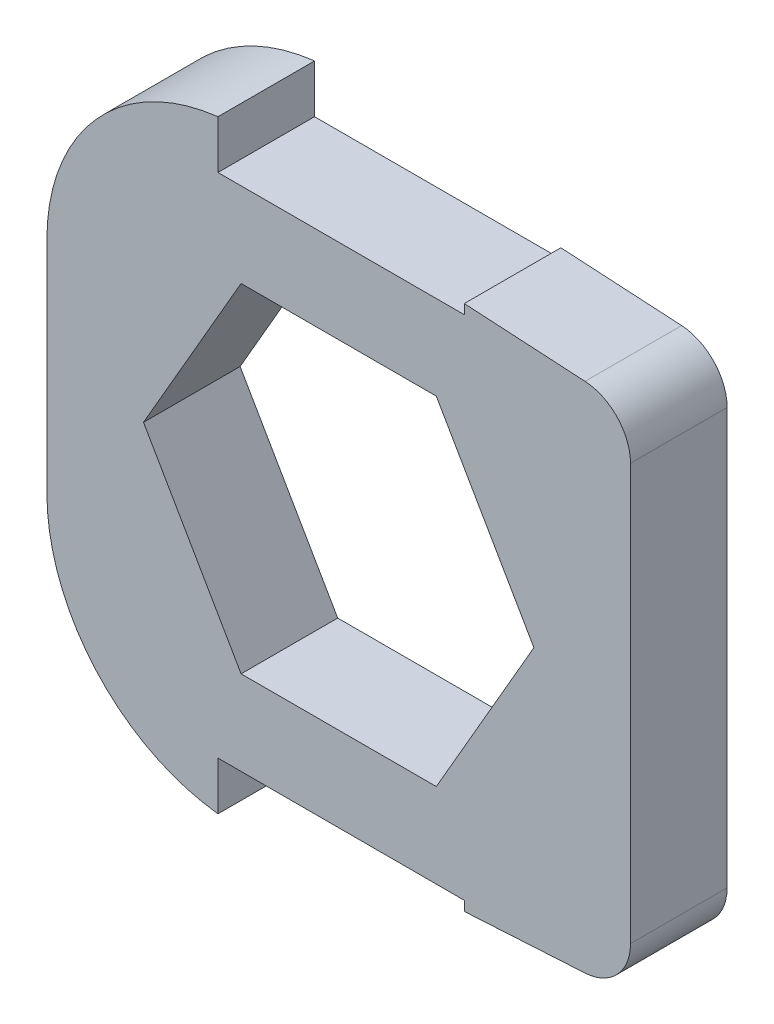
ISO-10303-21;
HEADER;
FILE_DESCRIPTION(('STEP AP214'),'2;1');
FILE_NAME('part.step','',(''),(''),'','','');
FILE_SCHEMA(('AUTOMOTIVE_DESIGN { 1 0 10303 214 1 1 1 1 }'));
ENDSEC;
DATA;
#1=APPLICATION_CONTEXT('core data for automotive mechanical design processes');
#2=APPLICATION_PROTOCOL_DEFINITION('international standard','automotive_design',2000,#1);
#3=PRODUCT_CONTEXT('',#1,'mechanical');
#4=PRODUCT('Part','Part','',(#3));
#5=PRODUCT_RELATED_PRODUCT_CATEGORY('part','',(#4));
#6=PRODUCT_DEFINITION_FORMATION('','',#4);
#7=PRODUCT_DEFINITION_CONTEXT('part definition',#1,'design');
#8=PRODUCT_DEFINITION('design','',#6,#7);
#9=PRODUCT_DEFINITION_SHAPE('','',#8);
#10=(LENGTH_UNIT() NAMED_UNIT(*) SI_UNIT(.MILLI.,.METRE.));
#11=(NAMED_UNIT(*) PLANE_ANGLE_UNIT() SI_UNIT($,.RADIAN.));
#12=(NAMED_UNIT(*) SI_UNIT($,.STERADIAN.) SOLID_ANGLE_UNIT());
#13=UNCERTAINTY_MEASURE_WITH_UNIT(LENGTH_MEASURE(1.E-05),#10,'distance_accuracy_value','');
#14=(GEOMETRIC_REPRESENTATION_CONTEXT(3) GLOBAL_UNCERTAINTY_ASSIGNED_CONTEXT((#13)) GLOBAL_UNIT_ASSIGNED_CONTEXT((#10,
#11,#12)) REPRESENTATION_CONTEXT('',''));
#15=CARTESIAN_POINT('',(0.,0.,0.));
#16=DIRECTION('',(0.,0.,1.));
#17=DIRECTION('',(1.,0.,0.));
#18=AXIS2_PLACEMENT_3D('',#15,#16,#17);
#19=CARTESIAN_POINT('',(0.,0.,2.));
#20=DIRECTION('',(0.,0.,-1.));
#21=DIRECTION('',(-1.,0.,0.));
#22=AXIS2_PLACEMENT_3D('',#19,#20,#21);
#23=PLANE('',#22);
#24=DIRECTION('',(0.998315588428416,0.0580171173088202,0.));
#25=VECTOR('',#24,1.);
#26=CARTESIAN_POINT('',(12.0829037686548,-5.25000000000001,2.));
#27=LINE('',#26,#25);
#28=CARTESIAN_POINT('',(8.64145188432738,-5.45000000000001,2.));
#29=VERTEX_POINT('',#28);
#30=CARTESIAN_POINT('',(11.1409208859636,-5.30474334172627,2.));
#31=VERTEX_POINT('',#30);
#32=EDGE_CURVE('E290',#29,#31,#27,.T.);
#33=ORIENTED_EDGE('',*,*,#32,.T.);
#34=CARTESIAN_POINT('',(11.0829037686548,-4.30642775329785,2.));
#35=DIRECTION('',(0.,0.,-1.));
#36=DIRECTION('',(-1.,0.,0.));
#37=AXIS2_PLACEMENT_3D('',#34,#35,#36);
#38=CIRCLE('',#37,1.);
#39=CARTESIAN_POINT('',(12.0829037686548,-4.30642775329785,2.));
#40=VERTEX_POINT('',#39);
#41=EDGE_CURVE('E51',#31,#40,#38,.F.);
#42=ORIENTED_EDGE('',*,*,#41,.T.);
#43=DIRECTION('',(0.,1.,0.));
#44=VECTOR('',#43,1.);
#45=CARTESIAN_POINT('',(12.0829037686548,5.25000000000001,2.));
#46=LINE('',#45,#44);
#47=CARTESIAN_POINT('',(12.0829037686548,4.30642775329786,2.));
#48=VERTEX_POINT('',#47);
#49=EDGE_CURVE('E294',#40,#48,#46,.T.);
#50=ORIENTED_EDGE('',*,*,#49,.T.);
#51=CARTESIAN_POINT('',(11.0829037686548,4.30642775329786,2.));
#52=DIRECTION('',(0.,0.,-1.));
#53=DIRECTION('',(-1.,0.,0.));
#54=AXIS2_PLACEMENT_3D('',#51,#52,#53);
#55=CIRCLE('',#54,1.);
#56=CARTESIAN_POINT('',(11.1409208859636,5.30474334172627,2.));
#57=VERTEX_POINT('',#56);
#58=EDGE_CURVE('E58',#48,#57,#55,.F.);
#59=ORIENTED_EDGE('',*,*,#58,.T.);
#60=DIRECTION('',(-0.998315588428416,0.0580171173088202,0.));
#61=VECTOR('',#60,1.);
#62=CARTESIAN_POINT('',(12.0829037686548,5.25000000000001,2.));
#63=LINE('',#62,#61);
#64=CARTESIAN_POINT('',(8.64145188432738,5.45000000000001,2.));
#65=VERTEX_POINT('',#64);
#66=EDGE_CURVE('E302',#57,#65,#63,.T.);
#67=ORIENTED_EDGE('',*,*,#66,.T.);
#68=DIRECTION('',(0.,-1.,0.));
#69=VECTOR('',#68,1.);
#70=CARTESIAN_POINT('',(8.64145188432738,5.45000000000001,2.));
#71=LINE('',#70,#69);
#72=CARTESIAN_POINT('',(8.64145188432738,5.25000000000001,2.));
#73=VERTEX_POINT('',#72);
#74=EDGE_CURVE('E305',#65,#73,#71,.T.);
#75=ORIENTED_EDGE('',*,*,#74,.T.);
#76=DIRECTION('',(-1.,0.,0.));
#77=VECTOR('',#76,1.);
#78=CARTESIAN_POINT('',(8.64145188432738,5.25000000000001,2.));
#79=LINE('',#78,#77);
#80=CARTESIAN_POINT('',(3.54145188432738,5.25000000000001,2.));
#81=VERTEX_POINT('',#80);
#82=EDGE_CURVE('E309',#73,#81,#79,.T.);
#83=ORIENTED_EDGE('',*,*,#82,.T.);
#84=DIRECTION('',(0.,1.,0.));
#85=VECTOR('',#84,1.);
#86=CARTESIAN_POINT('',(3.54145188432738,6.25000000000001,2.));
#87=LINE('',#86,#85);
#88=CARTESIAN_POINT('',(3.54145188432738,6.25000000000001,2.));
#89=VERTEX_POINT('',#88);
#90=EDGE_CURVE('E312',#81,#89,#87,.T.);
#91=ORIENTED_EDGE('',*,*,#90,.T.);
#92=CARTESIAN_POINT('',(4.,2.27637022036362,2.));
#93=DIRECTION('',(0.,0.,-1.));
#94=DIRECTION('',(-1.,0.,0.));
#95=AXIS2_PLACEMENT_3D('',#92,#93,#94);
#96=CIRCLE('',#95,4.);
#97=CARTESIAN_POINT('',(0.,2.27637022036362,2.));
#98=VERTEX_POINT('',#97);
#99=EDGE_CURVE('E392',#89,#98,#96,.F.);
#100=ORIENTED_EDGE('',*,*,#99,.T.);
#101=DIRECTION('',(0.,-1.,0.));
#102=VECTOR('',#101,1.);
#103=CARTESIAN_POINT('',(0.,-6.25000000000001,2.));
#104=LINE('',#103,#102);
#105=CARTESIAN_POINT('',(0.,-2.27637022036362,2.));
#106=VERTEX_POINT('',#105);
#107=EDGE_CURVE('E266',#98,#106,#104,.T.);
#108=ORIENTED_EDGE('',*,*,#107,.T.);
#109=CARTESIAN_POINT('',(4.,-2.27637022036362,2.));
#110=DIRECTION('',(0.,0.,-1.));
#111=DIRECTION('',(-1.,0.,0.));
#112=AXIS2_PLACEMENT_3D('',#109,#110,#111);
#113=CIRCLE('',#112,4.);
#114=CARTESIAN_POINT('',(3.54145188432738,-6.25000000000001,2.));
#115=VERTEX_POINT('',#114);
#116=EDGE_CURVE('E395',#106,#115,#113,.F.);
#117=ORIENTED_EDGE('',*,*,#116,.T.);
#118=DIRECTION('',(0.,1.,0.));
#119=VECTOR('',#118,1.);
#120=CARTESIAN_POINT('',(3.54145188432738,-5.25000000000001,2.));
#121=LINE('',#120,#119);
#122=CARTESIAN_POINT('',(3.54145188432738,-5.25000000000001,2.));
#123=VERTEX_POINT('',#122);
#124=EDGE_CURVE('E271',#115,#123,#121,.T.);
#125=ORIENTED_EDGE('',*,*,#124,.T.);
#126=DIRECTION('',(1.,0.,0.));
#127=VECTOR('',#126,1.);
#128=CARTESIAN_POINT('',(8.64145188432738,-5.25000000000001,2.));
#129=LINE('',#128,#127);
#130=CARTESIAN_POINT('',(8.64145188432738,-5.25000000000001,2.));
#131=VERTEX_POINT('',#130);
#132=EDGE_CURVE('E283',#123,#131,#129,.T.);
#133=ORIENTED_EDGE('',*,*,#132,.T.);
#134=DIRECTION('',(0.,-1.,0.));
#135=VECTOR('',#134,1.);
#136=CARTESIAN_POINT('',(8.64145188432738,-5.45000000000001,2.));
#137=LINE('',#136,#135);
#138=EDGE_CURVE('E286',#131,#29,#137,.T.);
#139=ORIENTED_EDGE('',*,*,#138,.T.);
#140=EDGE_LOOP('',(#33,#42,#50,#59,#67,#75,#83,#91,#100,#108,#117,#125,#133,#139));
#141=FACE_BOUND('',#140,.T.);
#142=DIRECTION('',(-0.5,-0.866025403784438,0.));
#143=VECTOR('',#142,1.);
#144=CARTESIAN_POINT('',(4.02072594216369,3.5,2.));
#145=LINE('',#144,#143);
#146=CARTESIAN_POINT('',(4.02072594216369,3.5,2.));
#147=VERTEX_POINT('',#146);
#148=CARTESIAN_POINT('',(2.,0.,2.));
#149=VERTEX_POINT('',#148);
#150=EDGE_CURVE('E184',#147,#149,#145,.T.);
#151=ORIENTED_EDGE('',*,*,#150,.F.);
#152=DIRECTION('',(-1.,0.,0.));
#153=VECTOR('',#152,1.);
#154=CARTESIAN_POINT('',(8.06217782649107,3.5,2.));
#155=LINE('',#154,#153);
#156=CARTESIAN_POINT('',(8.06217782649107,3.5,2.));
#157=VERTEX_POINT('',#156);
#158=EDGE_CURVE('E229',#157,#147,#155,.T.);
#159=ORIENTED_EDGE('',*,*,#158,.F.);
#160=DIRECTION('',(-0.5,0.866025403784439,0.));
#161=VECTOR('',#160,1.);
#162=CARTESIAN_POINT('',(10.0829037686548,0.,2.));
#163=LINE('',#162,#161);
#164=CARTESIAN_POINT('',(10.0829037686548,0.,2.));
#165=VERTEX_POINT('',#164);
#166=EDGE_CURVE('E225',#165,#157,#163,.T.);
#167=ORIENTED_EDGE('',*,*,#166,.F.);
#168=DIRECTION('',(0.5,0.866025403784439,0.));
#169=VECTOR('',#168,1.);
#170=CARTESIAN_POINT('',(8.06217782649107,-3.50000000000001,2.));
#171=LINE('',#170,#169);
#172=CARTESIAN_POINT('',(8.06217782649107,-3.50000000000001,2.));
#173=VERTEX_POINT('',#172);
#174=EDGE_CURVE('E212',#173,#165,#171,.T.);
#175=ORIENTED_EDGE('',*,*,#174,.F.);
#176=DIRECTION('',(1.,0.,0.));
#177=VECTOR('',#176,1.);
#178=CARTESIAN_POINT('',(4.02072594216369,-3.5,2.));
#179=LINE('',#178,#177);
#180=CARTESIAN_POINT('',(4.02072594216369,-3.5,2.));
#181=VERTEX_POINT('',#180);
#182=EDGE_CURVE('E209',#181,#173,#179,.T.);
#183=ORIENTED_EDGE('',*,*,#182,.F.);
#184=DIRECTION('',(0.5,-0.866025403784439,0.));
#185=VECTOR('',#184,1.);
#186=CARTESIAN_POINT('',(2.,0.,2.));
#187=LINE('',#186,#185);
#188=EDGE_CURVE('E195',#149,#181,#187,.T.);
#189=ORIENTED_EDGE('',*,*,#188,.F.);
#190=EDGE_LOOP('',(#151,#159,#167,#175,#183,#189));
#191=FACE_BOUND('',#190,.T.);
#192=ADVANCED_FACE('F42',(#141,#191),#23,.F.);
#193=CARTESIAN_POINT('',(0.,0.,0.));
#194=DIRECTION('',(0.,0.,-1.));
#195=DIRECTION('',(-1.,0.,0.));
#196=AXIS2_PLACEMENT_3D('',#193,#194,#195);
#197=PLANE('',#196);
#198=DIRECTION('',(0.,1.,0.));
#199=VECTOR('',#198,1.);
#200=CARTESIAN_POINT('',(12.0829037686548,5.25000000000001,0.));
#201=LINE('',#200,#199);
#202=CARTESIAN_POINT('',(12.0829037686548,-4.30642775329785,0.));
#203=VERTEX_POINT('',#202);
#204=CARTESIAN_POINT('',(12.0829037686548,4.30642775329786,0.));
#205=VERTEX_POINT('',#204);
#206=EDGE_CURVE('E332',#203,#205,#201,.T.);
#207=ORIENTED_EDGE('',*,*,#206,.F.);
#208=CARTESIAN_POINT('',(11.0829037686548,-4.30642775329785,0.));
#209=DIRECTION('',(0.,0.,-1.));
#210=DIRECTION('',(-1.,0.,0.));
#211=AXIS2_PLACEMENT_3D('',#208,#209,#210);
#212=CIRCLE('',#211,1.);
#213=CARTESIAN_POINT('',(11.1409208859636,-5.30474334172627,0.));
#214=VERTEX_POINT('',#213);
#215=EDGE_CURVE('E408',#203,#214,#212,.T.);
#216=ORIENTED_EDGE('',*,*,#215,.T.);
#217=DIRECTION('',(0.998315588428416,0.0580171173088202,0.));
#218=VECTOR('',#217,1.);
#219=CARTESIAN_POINT('',(12.0829037686548,-5.25000000000001,0.));
#220=LINE('',#219,#218);
#221=CARTESIAN_POINT('',(8.64145188432738,-5.45000000000001,0.));
#222=VERTEX_POINT('',#221);
#223=EDGE_CURVE('E329',#222,#214,#220,.T.);
#224=ORIENTED_EDGE('',*,*,#223,.F.);
#225=DIRECTION('',(0.,-1.,0.));
#226=VECTOR('',#225,1.);
#227=CARTESIAN_POINT('',(8.64145188432738,-5.45000000000001,0.));
#228=LINE('',#227,#226);
#229=CARTESIAN_POINT('',(8.64145188432738,-5.25000000000001,0.));
#230=VERTEX_POINT('',#229);
#231=EDGE_CURVE('E326',#230,#222,#228,.T.);
#232=ORIENTED_EDGE('',*,*,#231,.F.);
#233=DIRECTION('',(1.,0.,0.));
#234=VECTOR('',#233,1.);
#235=CARTESIAN_POINT('',(8.64145188432738,-5.25000000000001,0.));
#236=LINE('',#235,#234);
#237=CARTESIAN_POINT('',(3.54145188432738,-5.25000000000001,0.));
#238=VERTEX_POINT('',#237);
#239=EDGE_CURVE('E323',#238,#230,#236,.T.);
#240=ORIENTED_EDGE('',*,*,#239,.F.);
#241=DIRECTION('',(0.,1.,0.));
#242=VECTOR('',#241,1.);
#243=CARTESIAN_POINT('',(3.54145188432738,-5.25000000000001,0.));
#244=LINE('',#243,#242);
#245=CARTESIAN_POINT('',(3.54145188432738,-6.25000000000001,0.));
#246=VERTEX_POINT('',#245);
#247=EDGE_CURVE('E320',#246,#238,#244,.T.);
#248=ORIENTED_EDGE('',*,*,#247,.F.);
#249=CARTESIAN_POINT('',(4.,-2.27637022036362,0.));
#250=DIRECTION('',(0.,0.,-1.));
#251=DIRECTION('',(-1.,0.,0.));
#252=AXIS2_PLACEMENT_3D('',#249,#250,#251);
#253=CIRCLE('',#252,4.);
#254=CARTESIAN_POINT('',(0.,-2.27637022036362,0.));
#255=VERTEX_POINT('',#254);
#256=EDGE_CURVE('E382',#246,#255,#253,.T.);
#257=ORIENTED_EDGE('',*,*,#256,.T.);
#258=DIRECTION('',(0.,-1.,0.));
#259=VECTOR('',#258,1.);
#260=CARTESIAN_POINT('',(0.,-6.25000000000001,0.));
#261=LINE('',#260,#259);
#262=CARTESIAN_POINT('',(0.,2.27637022036362,0.));
#263=VERTEX_POINT('',#262);
#264=EDGE_CURVE('E204',#263,#255,#261,.T.);
#265=ORIENTED_EDGE('',*,*,#264,.F.);
#266=CARTESIAN_POINT('',(4.,2.27637022036362,0.));
#267=DIRECTION('',(0.,0.,-1.));
#268=DIRECTION('',(-1.,0.,0.));
#269=AXIS2_PLACEMENT_3D('',#266,#267,#268);
#270=CIRCLE('',#269,4.);
#271=CARTESIAN_POINT('',(3.54145188432738,6.25000000000001,0.));
#272=VERTEX_POINT('',#271);
#273=EDGE_CURVE('E379',#263,#272,#270,.T.);
#274=ORIENTED_EDGE('',*,*,#273,.T.);
#275=DIRECTION('',(0.,1.,0.));
#276=VECTOR('',#275,1.);
#277=CARTESIAN_POINT('',(3.54145188432738,6.25000000000001,0.));
#278=LINE('',#277,#276);
#279=CARTESIAN_POINT('',(3.54145188432738,5.25000000000001,0.));
#280=VERTEX_POINT('',#279);
#281=EDGE_CURVE('E272',#280,#272,#278,.T.);
#282=ORIENTED_EDGE('',*,*,#281,.F.);
#283=DIRECTION('',(-1.,0.,0.));
#284=VECTOR('',#283,1.);
#285=CARTESIAN_POINT('',(8.64145188432738,5.25000000000001,0.));
#286=LINE('',#285,#284);
#287=CARTESIAN_POINT('',(8.64145188432738,5.25000000000001,0.));
#288=VERTEX_POINT('',#287);
#289=EDGE_CURVE('E342',#288,#280,#286,.T.);
#290=ORIENTED_EDGE('',*,*,#289,.F.);
#291=DIRECTION('',(0.,-1.,0.));
#292=VECTOR('',#291,1.);
#293=CARTESIAN_POINT('',(8.64145188432738,5.45000000000001,0.));
#294=LINE('',#293,#292);
#295=CARTESIAN_POINT('',(8.64145188432738,5.45000000000001,0.));
#296=VERTEX_POINT('',#295);
#297=EDGE_CURVE('E339',#296,#288,#294,.T.);
#298=ORIENTED_EDGE('',*,*,#297,.F.);
#299=DIRECTION('',(-0.998315588428416,0.0580171173088202,0.));
#300=VECTOR('',#299,1.);
#301=CARTESIAN_POINT('',(12.0829037686548,5.25000000000001,0.));
#302=LINE('',#301,#300);
#303=CARTESIAN_POINT('',(11.1409208859636,5.30474334172627,0.));
#304=VERTEX_POINT('',#303);
#305=EDGE_CURVE('E336',#304,#296,#302,.T.);
#306=ORIENTED_EDGE('',*,*,#305,.F.);
#307=CARTESIAN_POINT('',(11.0829037686548,4.30642775329786,0.));
#308=DIRECTION('',(0.,0.,-1.));
#309=DIRECTION('',(-1.,0.,0.));
#310=AXIS2_PLACEMENT_3D('',#307,#308,#309);
#311=CIRCLE('',#310,1.);
#312=EDGE_CURVE('E405',#304,#205,#311,.T.);
#313=ORIENTED_EDGE('',*,*,#312,.T.);
#314=EDGE_LOOP('',(#207,#216,#224,#232,#240,#248,#257,#265,#274,#282,#290,#298,#306,#313));
#315=FACE_BOUND('',#314,.T.);
#316=DIRECTION('',(-1.,0.,0.));
#317=VECTOR('',#316,1.);
#318=CARTESIAN_POINT('',(8.06217782649107,3.5,0.));
#319=LINE('',#318,#317);
#320=CARTESIAN_POINT('',(8.06217782649107,3.5,0.));
#321=VERTEX_POINT('',#320);
#322=CARTESIAN_POINT('',(4.02072594216369,3.5,0.));
#323=VERTEX_POINT('',#322);
#324=EDGE_CURVE('E196',#321,#323,#319,.T.);
#325=ORIENTED_EDGE('',*,*,#324,.T.);
#326=DIRECTION('',(-0.5,-0.866025403784438,0.));
#327=VECTOR('',#326,1.);
#328=CARTESIAN_POINT('',(4.02072594216369,3.5,0.));
#329=LINE('',#328,#327);
#330=CARTESIAN_POINT('',(2.,0.,0.));
#331=VERTEX_POINT('',#330);
#332=EDGE_CURVE('E233',#323,#331,#329,.T.);
#333=ORIENTED_EDGE('',*,*,#332,.T.);
#334=DIRECTION('',(0.5,-0.866025403784439,0.));
#335=VECTOR('',#334,1.);
#336=CARTESIAN_POINT('',(2.,0.,0.));
#337=LINE('',#336,#335);
#338=CARTESIAN_POINT('',(4.02072594216369,-3.5,0.));
#339=VERTEX_POINT('',#338);
#340=EDGE_CURVE('E202',#331,#339,#337,.T.);
#341=ORIENTED_EDGE('',*,*,#340,.T.);
#342=DIRECTION('',(1.,0.,0.));
#343=VECTOR('',#342,1.);
#344=CARTESIAN_POINT('',(4.02072594216369,-3.5,0.));
#345=LINE('',#344,#343);
#346=CARTESIAN_POINT('',(8.06217782649107,-3.50000000000001,0.));
#347=VERTEX_POINT('',#346);
#348=EDGE_CURVE('E238',#339,#347,#345,.T.);
#349=ORIENTED_EDGE('',*,*,#348,.T.);
#350=DIRECTION('',(0.5,0.866025403784439,0.));
#351=VECTOR('',#350,1.);
#352=CARTESIAN_POINT('',(8.06217782649107,-3.50000000000001,0.));
#353=LINE('',#352,#351);
#354=CARTESIAN_POINT('',(10.0829037686548,0.,0.));
#355=VERTEX_POINT('',#354);
#356=EDGE_CURVE('E242',#347,#355,#353,.T.);
#357=ORIENTED_EDGE('',*,*,#356,.T.);
#358=DIRECTION('',(-0.5,0.866025403784439,0.));
#359=VECTOR('',#358,1.);
#360=CARTESIAN_POINT('',(10.0829037686548,0.,0.));
#361=LINE('',#360,#359);
#362=EDGE_CURVE('E246',#355,#321,#361,.T.);
#363=ORIENTED_EDGE('',*,*,#362,.T.);
#364=EDGE_LOOP('',(#325,#333,#341,#349,#357,#363));
#365=FACE_BOUND('',#364,.T.);
#366=ADVANCED_FACE('F427',(#315,#365),#197,.T.);
#367=CARTESIAN_POINT('',(0.,-6.25000000000001,2.));
#368=DIRECTION('',(1.,0.,0.));
#369=DIRECTION('',(0.,0.,-1.));
#370=AXIS2_PLACEMENT_3D('',#367,#368,#369);
#371=PLANE('',#370);
#372=ORIENTED_EDGE('',*,*,#264,.T.);
#373=DIRECTION('',(0.,0.,1.));
#374=VECTOR('',#373,1.);
#375=CARTESIAN_POINT('',(0.,-2.27637022036362,2.));
#376=LINE('',#375,#374);
#377=EDGE_CURVE('E389',#255,#106,#376,.T.);
#378=ORIENTED_EDGE('',*,*,#377,.T.);
#379=ORIENTED_EDGE('',*,*,#107,.F.);
#380=DIRECTION('',(0.,0.,-1.));
#381=VECTOR('',#380,1.);
#382=CARTESIAN_POINT('',(0.,2.27637022036362,2.));
#383=LINE('',#382,#381);
#384=EDGE_CURVE('E385',#98,#263,#383,.T.);
#385=ORIENTED_EDGE('',*,*,#384,.T.);
#386=EDGE_LOOP('',(#372,#378,#379,#385));
#387=FACE_BOUND('',#386,.T.);
#388=ADVANCED_FACE('F452',(#387),#371,.F.);
#389=CARTESIAN_POINT('',(3.54145188432738,-5.25000000000001,2.));
#390=DIRECTION('',(-1.,0.,0.));
#391=DIRECTION('',(0.,-1.,0.));
#392=AXIS2_PLACEMENT_3D('',#389,#390,#391);
#393=PLANE('',#392);
#394=ORIENTED_EDGE('',*,*,#247,.T.);
#395=DIRECTION('',(0.,0.,-1.));
#396=VECTOR('',#395,1.);
#397=CARTESIAN_POINT('',(3.54145188432738,-5.25000000000001,2.));
#398=LINE('',#397,#396);
#399=EDGE_CURVE('E371',#123,#238,#398,.T.);
#400=ORIENTED_EDGE('',*,*,#399,.F.);
#401=ORIENTED_EDGE('',*,*,#124,.F.);
#402=DIRECTION('',(0.,0.,-1.));
#403=VECTOR('',#402,1.);
#404=CARTESIAN_POINT('',(3.54145188432738,-6.25000000000001,2.));
#405=LINE('',#404,#403);
#406=EDGE_CURVE('E375',#115,#246,#405,.T.);
#407=ORIENTED_EDGE('',*,*,#406,.T.);
#408=EDGE_LOOP('',(#394,#400,#401,#407));
#409=FACE_BOUND('',#408,.T.);
#410=ADVANCED_FACE('F444',(#409),#393,.F.);
#411=CARTESIAN_POINT('',(8.64145188432738,-5.25000000000001,2.));
#412=DIRECTION('',(0.,1.,0.));
#413=DIRECTION('',(0.,0.,1.));
#414=AXIS2_PLACEMENT_3D('',#411,#412,#413);
#415=PLANE('',#414);
#416=ORIENTED_EDGE('',*,*,#239,.T.);
#417=DIRECTION('',(0.,0.,-1.));
#418=VECTOR('',#417,1.);
#419=CARTESIAN_POINT('',(8.64145188432738,-5.25000000000001,2.));
#420=LINE('',#419,#418);
#421=EDGE_CURVE('E367',#131,#230,#420,.T.);
#422=ORIENTED_EDGE('',*,*,#421,.F.);
#423=ORIENTED_EDGE('',*,*,#132,.F.);
#424=ORIENTED_EDGE('',*,*,#399,.T.);
#425=EDGE_LOOP('',(#416,#422,#423,#424));
#426=FACE_BOUND('',#425,.T.);
#427=ADVANCED_FACE('F439',(#426),#415,.F.);
#428=CARTESIAN_POINT('',(8.64145188432738,-5.45000000000001,2.));
#429=DIRECTION('',(1.,0.,0.));
#430=DIRECTION('',(0.,0.,-1.));
#431=AXIS2_PLACEMENT_3D('',#428,#429,#430);
#432=PLANE('',#431);
#433=ORIENTED_EDGE('',*,*,#231,.T.);
#434=DIRECTION('',(0.,0.,-1.));
#435=VECTOR('',#434,1.);
#436=CARTESIAN_POINT('',(8.64145188432738,-5.45000000000001,2.));
#437=LINE('',#436,#435);
#438=EDGE_CURVE('E363',#29,#222,#437,.T.);
#439=ORIENTED_EDGE('',*,*,#438,.F.);
#440=ORIENTED_EDGE('',*,*,#138,.F.);
#441=ORIENTED_EDGE('',*,*,#421,.T.);
#442=EDGE_LOOP('',(#433,#439,#440,#441));
#443=FACE_BOUND('',#442,.T.);
#444=ADVANCED_FACE('F434',(#443),#432,.F.);
#445=CARTESIAN_POINT('',(12.0829037686548,-5.25000000000001,2.));
#446=DIRECTION('',(-0.0580171173088202,0.998315588428416,0.));
#447=DIRECTION('',(-0.998315588428416,-0.0580171173088202,0.));
#448=AXIS2_PLACEMENT_3D('',#445,#446,#447);
#449=PLANE('',#448);
#450=ORIENTED_EDGE('',*,*,#223,.T.);
#451=DIRECTION('',(0.,0.,-1.));
#452=VECTOR('',#451,1.);
#453=CARTESIAN_POINT('',(11.1409208859636,-5.30474334172627,2.));
#454=LINE('',#453,#452);
#455=EDGE_CURVE('E66',#214,#31,#454,.F.);
#456=ORIENTED_EDGE('',*,*,#455,.T.);
#457=ORIENTED_EDGE('',*,*,#32,.F.);
#458=ORIENTED_EDGE('',*,*,#438,.T.);
#459=EDGE_LOOP('',(#450,#456,#457,#458));
#460=FACE_BOUND('',#459,.T.);
#461=ADVANCED_FACE('F430',(#460),#449,.F.);
#462=CARTESIAN_POINT('',(12.0829037686548,5.25000000000001,2.));
#463=DIRECTION('',(-1.,0.,0.));
#464=DIRECTION('',(0.,0.,1.));
#465=AXIS2_PLACEMENT_3D('',#462,#463,#464);
#466=PLANE('',#465);
#467=ORIENTED_EDGE('',*,*,#49,.F.);
#468=DIRECTION('',(0.,0.,-1.));
#469=VECTOR('',#468,1.);
#470=CARTESIAN_POINT('',(12.0829037686548,-4.30642775329785,2.));
#471=LINE('',#470,#469);
#472=EDGE_CURVE('E401',#40,#203,#471,.T.);
#473=ORIENTED_EDGE('',*,*,#472,.T.);
#474=ORIENTED_EDGE('',*,*,#206,.T.);
#475=DIRECTION('',(0.,0.,-1.));
#476=VECTOR('',#475,1.);
#477=CARTESIAN_POINT('',(12.0829037686548,4.30642775329786,2.));
#478=LINE('',#477,#476);
#479=EDGE_CURVE('E398',#205,#48,#478,.F.);
#480=ORIENTED_EDGE('',*,*,#479,.T.);
#481=EDGE_LOOP('',(#467,#473,#474,#480));
#482=FACE_BOUND('',#481,.T.);
#483=ADVANCED_FACE('F420',(#482),#466,.F.);
#484=CARTESIAN_POINT('',(12.0829037686548,5.25000000000001,2.));
#485=DIRECTION('',(-0.0580171173088202,-0.998315588428416,0.));
#486=DIRECTION('',(0.998315588428416,-0.0580171173088202,0.));
#487=AXIS2_PLACEMENT_3D('',#484,#485,#486);
#488=PLANE('',#487);
#489=ORIENTED_EDGE('',*,*,#66,.F.);
#490=DIRECTION('',(0.,0.,-1.));
#491=VECTOR('',#490,1.);
#492=CARTESIAN_POINT('',(11.1409208859636,5.30474334172627,2.));
#493=LINE('',#492,#491);
#494=EDGE_CURVE('E12',#57,#304,#493,.T.);
#495=ORIENTED_EDGE('',*,*,#494,.T.);
#496=ORIENTED_EDGE('',*,*,#305,.T.);
#497=DIRECTION('',(0.,0.,-1.));
#498=VECTOR('',#497,1.);
#499=CARTESIAN_POINT('',(8.64145188432738,5.45000000000001,2.));
#500=LINE('',#499,#498);
#501=EDGE_CURVE('E359',#65,#296,#500,.T.);
#502=ORIENTED_EDGE('',*,*,#501,.F.);
#503=EDGE_LOOP('',(#489,#495,#496,#502));
#504=FACE_BOUND('',#503,.T.);
#505=ADVANCED_FACE('F476',(#504),#488,.F.);
#506=CARTESIAN_POINT('',(8.64145188432738,5.45000000000001,2.));
#507=DIRECTION('',(1.,0.,0.));
#508=DIRECTION('',(0.,0.,-1.));
#509=AXIS2_PLACEMENT_3D('',#506,#507,#508);
#510=PLANE('',#509);
#511=ORIENTED_EDGE('',*,*,#297,.T.);
#512=DIRECTION('',(0.,0.,-1.));
#513=VECTOR('',#512,1.);
#514=CARTESIAN_POINT('',(8.64145188432738,5.25000000000001,2.));
#515=LINE('',#514,#513);
#516=EDGE_CURVE('E355',#73,#288,#515,.T.);
#517=ORIENTED_EDGE('',*,*,#516,.F.);
#518=ORIENTED_EDGE('',*,*,#74,.F.);
#519=ORIENTED_EDGE('',*,*,#501,.T.);
#520=EDGE_LOOP('',(#511,#517,#518,#519));
#521=FACE_BOUND('',#520,.T.);
#522=ADVANCED_FACE('F472',(#521),#510,.F.);
#523=CARTESIAN_POINT('',(8.64145188432738,5.25000000000001,2.));
#524=DIRECTION('',(0.,-1.,0.));
#525=DIRECTION('',(0.,0.,-1.));
#526=AXIS2_PLACEMENT_3D('',#523,#524,#525);
#527=PLANE('',#526);
#528=ORIENTED_EDGE('',*,*,#289,.T.);
#529=DIRECTION('',(0.,0.,-1.));
#530=VECTOR('',#529,1.);
#531=CARTESIAN_POINT('',(3.54145188432738,5.25000000000001,2.));
#532=LINE('',#531,#530);
#533=EDGE_CURVE('E351',#81,#280,#532,.T.);
#534=ORIENTED_EDGE('',*,*,#533,.F.);
#535=ORIENTED_EDGE('',*,*,#82,.F.);
#536=ORIENTED_EDGE('',*,*,#516,.T.);
#537=EDGE_LOOP('',(#528,#534,#535,#536));
#538=FACE_BOUND('',#537,.T.);
#539=ADVANCED_FACE('F467',(#538),#527,.F.);
#540=CARTESIAN_POINT('',(3.54145188432738,6.25000000000001,2.));
#541=DIRECTION('',(-1.,0.,0.));
#542=DIRECTION('',(0.,-1.,0.));
#543=AXIS2_PLACEMENT_3D('',#540,#541,#542);
#544=PLANE('',#543);
#545=ORIENTED_EDGE('',*,*,#281,.T.);
#546=DIRECTION('',(0.,0.,-1.));
#547=VECTOR('',#546,1.);
#548=CARTESIAN_POINT('',(3.54145188432738,6.25000000000001,2.));
#549=LINE('',#548,#547);
#550=EDGE_CURVE('E316',#89,#272,#549,.T.);
#551=ORIENTED_EDGE('',*,*,#550,.F.);
#552=ORIENTED_EDGE('',*,*,#90,.F.);
#553=ORIENTED_EDGE('',*,*,#533,.T.);
#554=EDGE_LOOP('',(#545,#551,#552,#553));
#555=FACE_BOUND('',#554,.T.);
#556=ADVANCED_FACE('F462',(#555),#544,.F.);
#557=CARTESIAN_POINT('',(4.02072594216369,3.5,2.));
#558=DIRECTION('',(0.866025403784438,-0.5,0.));
#559=DIRECTION('',(0.5,0.866025403784439,0.));
#560=AXIS2_PLACEMENT_3D('',#557,#558,#559);
#561=PLANE('',#560);
#562=ORIENTED_EDGE('',*,*,#332,.F.);
#563=DIRECTION('',(0.,0.,-1.));
#564=VECTOR('',#563,1.);
#565=CARTESIAN_POINT('',(4.02072594216369,3.5,2.));
#566=LINE('',#565,#564);
#567=EDGE_CURVE('E190',#147,#323,#566,.T.);
#568=ORIENTED_EDGE('',*,*,#567,.F.);
#569=ORIENTED_EDGE('',*,*,#150,.T.);
#570=DIRECTION('',(0.,0.,-1.));
#571=VECTOR('',#570,1.);
#572=CARTESIAN_POINT('',(2.,0.,2.));
#573=LINE('',#572,#571);
#574=EDGE_CURVE('E187',#149,#331,#573,.T.);
#575=ORIENTED_EDGE('',*,*,#574,.T.);
#576=EDGE_LOOP('',(#562,#568,#569,#575));
#577=FACE_BOUND('',#576,.T.);
#578=ADVANCED_FACE('F186',(#577),#561,.T.);
#579=CARTESIAN_POINT('',(2.,0.,2.));
#580=DIRECTION('',(0.866025403784438,0.5,0.));
#581=DIRECTION('',(-0.5,0.866025403784439,0.));
#582=AXIS2_PLACEMENT_3D('',#579,#580,#581);
#583=PLANE('',#582);
#584=ORIENTED_EDGE('',*,*,#340,.F.);
#585=ORIENTED_EDGE('',*,*,#574,.F.);
#586=ORIENTED_EDGE('',*,*,#188,.T.);
#587=DIRECTION('',(0.,0.,-1.));
#588=VECTOR('',#587,1.);
#589=CARTESIAN_POINT('',(4.02072594216369,-3.5,2.));
#590=LINE('',#589,#588);
#591=EDGE_CURVE('E205',#181,#339,#590,.T.);
#592=ORIENTED_EDGE('',*,*,#591,.T.);
#593=EDGE_LOOP('',(#584,#585,#586,#592));
#594=FACE_BOUND('',#593,.T.);
#595=ADVANCED_FACE('F199',(#594),#583,.T.);
#596=CARTESIAN_POINT('',(4.02072594216369,-3.5,2.));
#597=DIRECTION('',(0.,1.,0.));
#598=DIRECTION('',(-1.,0.,0.));
#599=AXIS2_PLACEMENT_3D('',#596,#597,#598);
#600=PLANE('',#599);
#601=ORIENTED_EDGE('',*,*,#348,.F.);
#602=ORIENTED_EDGE('',*,*,#591,.F.);
#603=ORIENTED_EDGE('',*,*,#182,.T.);
#604=DIRECTION('',(0.,0.,-1.));
#605=VECTOR('',#604,1.);
#606=CARTESIAN_POINT('',(8.06217782649107,-3.50000000000001,2.));
#607=LINE('',#606,#605);
#608=EDGE_CURVE('E261',#173,#347,#607,.T.);
#609=ORIENTED_EDGE('',*,*,#608,.T.);
#610=EDGE_LOOP('',(#601,#602,#603,#609));
#611=FACE_BOUND('',#610,.T.);
#612=ADVANCED_FACE('F606',(#611),#600,.T.);
#613=CARTESIAN_POINT('',(8.06217782649107,-3.50000000000001,2.));
#614=DIRECTION('',(-0.866025403784439,0.5,0.));
#615=DIRECTION('',(-0.5,-0.866025403784439,0.));
#616=AXIS2_PLACEMENT_3D('',#613,#614,#615);
#617=PLANE('',#616);
#618=ORIENTED_EDGE('',*,*,#356,.F.);
#619=ORIENTED_EDGE('',*,*,#608,.F.);
#620=ORIENTED_EDGE('',*,*,#174,.T.);
#621=DIRECTION('',(0.,0.,-1.));
#622=VECTOR('',#621,1.);
#623=CARTESIAN_POINT('',(10.0829037686548,0.,2.));
#624=LINE('',#623,#622);
#625=EDGE_CURVE('E258',#165,#355,#624,.T.);
#626=ORIENTED_EDGE('',*,*,#625,.T.);
#627=EDGE_LOOP('',(#618,#619,#620,#626));
#628=FACE_BOUND('',#627,.T.);
#629=ADVANCED_FACE('F614',(#628),#617,.T.);
#630=CARTESIAN_POINT('',(10.0829037686548,0.,2.));
#631=DIRECTION('',(-0.866025403784439,-0.5,0.));
#632=DIRECTION('',(0.5,-0.866025403784439,0.));
#633=AXIS2_PLACEMENT_3D('',#630,#631,#632);
#634=PLANE('',#633);
#635=ORIENTED_EDGE('',*,*,#362,.F.);
#636=ORIENTED_EDGE('',*,*,#625,.F.);
#637=ORIENTED_EDGE('',*,*,#166,.T.);
#638=DIRECTION('',(0.,0.,-1.));
#639=VECTOR('',#638,1.);
#640=CARTESIAN_POINT('',(8.06217782649107,3.5,2.));
#641=LINE('',#640,#639);
#642=EDGE_CURVE('E255',#157,#321,#641,.T.);
#643=ORIENTED_EDGE('',*,*,#642,.T.);
#644=EDGE_LOOP('',(#635,#636,#637,#643));
#645=FACE_BOUND('',#644,.T.);
#646=ADVANCED_FACE('F624',(#645),#634,.T.);
#647=CARTESIAN_POINT('',(8.06217782649107,3.5,2.));
#648=DIRECTION('',(0.,-1.,0.));
#649=DIRECTION('',(1.,0.,0.));
#650=AXIS2_PLACEMENT_3D('',#647,#648,#649);
#651=PLANE('',#650);
#652=ORIENTED_EDGE('',*,*,#324,.F.);
#653=ORIENTED_EDGE('',*,*,#642,.F.);
#654=ORIENTED_EDGE('',*,*,#158,.T.);
#655=ORIENTED_EDGE('',*,*,#567,.T.);
#656=EDGE_LOOP('',(#652,#653,#654,#655));
#657=FACE_BOUND('',#656,.T.);
#658=ADVANCED_FACE('F514',(#657),#651,.T.);
#659=CARTESIAN_POINT('',(4.,-2.27637022036362,2.));
#660=DIRECTION('',(0.,0.,1.));
#661=DIRECTION('',(1.,0.,0.));
#662=AXIS2_PLACEMENT_3D('',#659,#660,#661);
#663=CYLINDRICAL_SURFACE('',#662,4.);
#664=ORIENTED_EDGE('',*,*,#116,.F.);
#665=ORIENTED_EDGE('',*,*,#377,.F.);
#666=ORIENTED_EDGE('',*,*,#256,.F.);
#667=ORIENTED_EDGE('',*,*,#406,.F.);
#668=EDGE_LOOP('',(#664,#665,#666,#667));
#669=FACE_BOUND('',#668,.T.);
#670=ADVANCED_FACE('F448',(#669),#663,.T.);
#671=CARTESIAN_POINT('',(4.,2.27637022036362,2.));
#672=DIRECTION('',(0.,0.,-1.));
#673=DIRECTION('',(-1.,0.,0.));
#674=AXIS2_PLACEMENT_3D('',#671,#672,#673);
#675=CYLINDRICAL_SURFACE('',#674,4.);
#676=ORIENTED_EDGE('',*,*,#99,.F.);
#677=ORIENTED_EDGE('',*,*,#550,.T.);
#678=ORIENTED_EDGE('',*,*,#273,.F.);
#679=ORIENTED_EDGE('',*,*,#384,.F.);
#680=EDGE_LOOP('',(#676,#677,#678,#679));
#681=FACE_BOUND('',#680,.T.);
#682=ADVANCED_FACE('F457',(#681),#675,.T.);
#683=CARTESIAN_POINT('',(11.0829037686548,-4.30642775329785,2.));
#684=DIRECTION('',(0.,0.,-1.));
#685=DIRECTION('',(-1.,0.,0.));
#686=AXIS2_PLACEMENT_3D('',#683,#684,#685);
#687=CYLINDRICAL_SURFACE('',#686,1.);
#688=ORIENTED_EDGE('',*,*,#41,.F.);
#689=ORIENTED_EDGE('',*,*,#455,.F.);
#690=ORIENTED_EDGE('',*,*,#215,.F.);
#691=ORIENTED_EDGE('',*,*,#472,.F.);
#692=EDGE_LOOP('',(#688,#689,#690,#691));
#693=FACE_BOUND('',#692,.T.);
#694=ADVANCED_FACE('F424',(#693),#687,.T.);
#695=CARTESIAN_POINT('',(11.0829037686548,4.30642775329786,2.));
#696=DIRECTION('',(0.,0.,-1.));
#697=DIRECTION('',(-1.,0.,0.));
#698=AXIS2_PLACEMENT_3D('',#695,#696,#697);
#699=CYLINDRICAL_SURFACE('',#698,1.);
#700=ORIENTED_EDGE('',*,*,#58,.F.);
#701=ORIENTED_EDGE('',*,*,#479,.F.);
#702=ORIENTED_EDGE('',*,*,#312,.F.);
#703=ORIENTED_EDGE('',*,*,#494,.F.);
#704=EDGE_LOOP('',(#700,#701,#702,#703));
#705=FACE_BOUND('',#704,.T.);
#706=ADVANCED_FACE('F44',(#705),#699,.T.);
#707=CLOSED_SHELL('',(#192,#366,#388,#410,#427,#444,#461,#483,#505,#522,#539,#556,#578,#595,
#612,#629,#646,#658,#670,#682,#694,#706));
#708=MANIFOLD_SOLID_BREP('B2',#707);
#709=ADVANCED_BREP_SHAPE_REPRESENTATION('',(#18,#708),#14);
#710=SHAPE_DEFINITION_REPRESENTATION(#9,#709);
ENDSEC;
END-ISO-10303-21;
